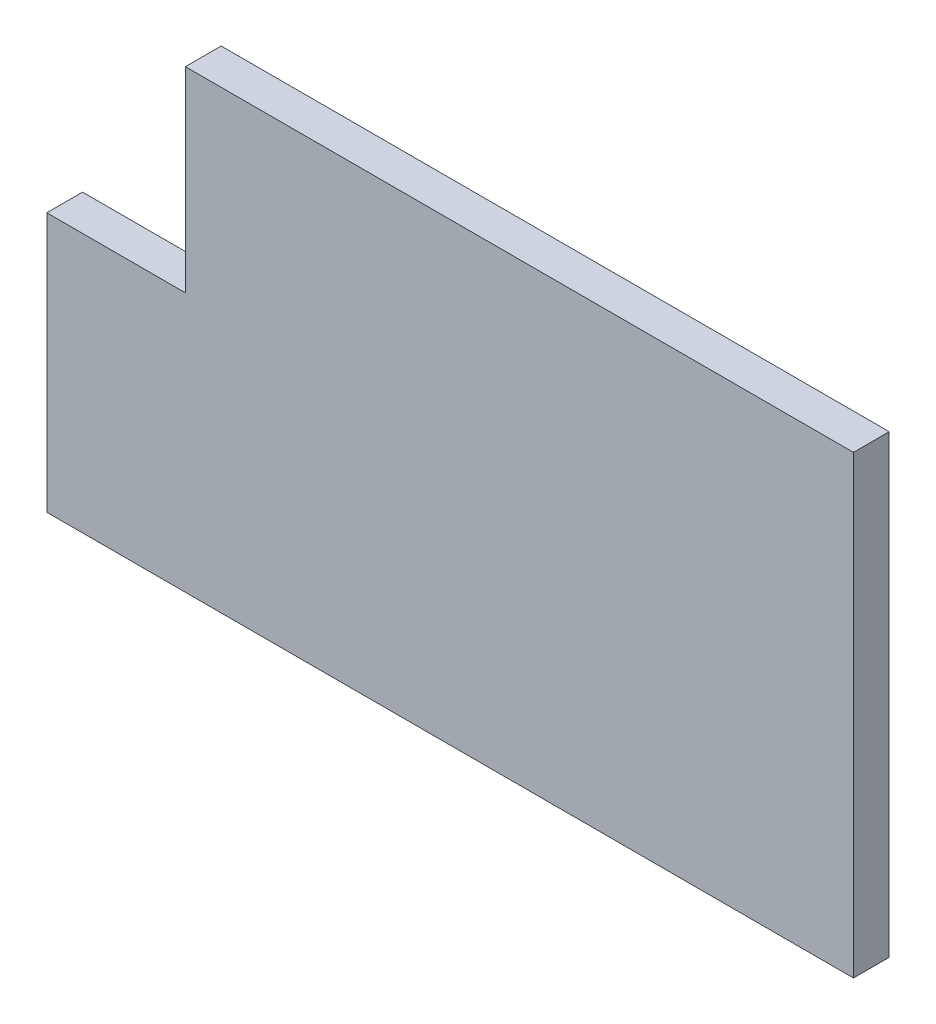
ISO-10303-21;
HEADER;
FILE_DESCRIPTION(('STEP AP214'),'2;1');
FILE_NAME('part.step','',(''),(''),'','','');
FILE_SCHEMA(('AUTOMOTIVE_DESIGN { 1 0 10303 214 1 1 1 1 }'));
ENDSEC;
DATA;
#1=APPLICATION_CONTEXT('core data for automotive mechanical design processes');
#2=APPLICATION_PROTOCOL_DEFINITION('international standard','automotive_design',2000,#1);
#3=PRODUCT_CONTEXT('',#1,'mechanical');
#4=PRODUCT('Part','Part','',(#3));
#5=PRODUCT_RELATED_PRODUCT_CATEGORY('part','',(#4));
#6=PRODUCT_DEFINITION_FORMATION('','',#4);
#7=PRODUCT_DEFINITION_CONTEXT('part definition',#1,'design');
#8=PRODUCT_DEFINITION('design','',#6,#7);
#9=PRODUCT_DEFINITION_SHAPE('','',#8);
#10=(LENGTH_UNIT() NAMED_UNIT(*) SI_UNIT(.MILLI.,.METRE.));
#11=(NAMED_UNIT(*) PLANE_ANGLE_UNIT() SI_UNIT($,.RADIAN.));
#12=(NAMED_UNIT(*) SI_UNIT($,.STERADIAN.) SOLID_ANGLE_UNIT());
#13=UNCERTAINTY_MEASURE_WITH_UNIT(LENGTH_MEASURE(1.E-05),#10,'distance_accuracy_value','');
#14=(GEOMETRIC_REPRESENTATION_CONTEXT(3) GLOBAL_UNCERTAINTY_ASSIGNED_CONTEXT((#13)) GLOBAL_UNIT_ASSIGNED_CONTEXT((#10,
#11,#12)) REPRESENTATION_CONTEXT('',''));
#15=CARTESIAN_POINT('',(0.,0.,0.));
#16=DIRECTION('',(0.,0.,1.));
#17=DIRECTION('',(1.,0.,0.));
#18=AXIS2_PLACEMENT_3D('',#15,#16,#17);
#19=CARTESIAN_POINT('',(606.354027490195,2129.28599467213,400.));
#20=DIRECTION('',(1.,0.,0.));
#21=DIRECTION('',(0.,0.,-1.));
#22=AXIS2_PLACEMENT_3D('',#19,#20,#21);
#23=PLANE('',#22);
#24=DIRECTION('',(0.,-1.,0.));
#25=VECTOR('',#24,1.);
#26=CARTESIAN_POINT('',(606.354027490195,2129.28599467213,0.));
#27=LINE('',#26,#25);
#28=CARTESIAN_POINT('',(606.354027490195,2129.28599467213,0.));
#29=VERTEX_POINT('',#28);
#30=CARTESIAN_POINT('',(606.354027490195,-60.7140053278613,0.));
#31=VERTEX_POINT('',#30);
#32=EDGE_CURVE('E117',#29,#31,#27,.T.);
#33=ORIENTED_EDGE('',*,*,#32,.T.);
#34=DIRECTION('',(0.,0.,-1.));
#35=VECTOR('',#34,1.);
#36=CARTESIAN_POINT('',(606.354027490195,-60.7140053278613,400.));
#37=LINE('',#36,#35);
#38=CARTESIAN_POINT('',(606.354027490195,-60.7140053278613,400.));
#39=VERTEX_POINT('',#38);
#40=EDGE_CURVE('E40',#39,#31,#37,.T.);
#41=ORIENTED_EDGE('',*,*,#40,.F.);
#42=DIRECTION('',(0.,-1.,0.));
#43=VECTOR('',#42,1.);
#44=CARTESIAN_POINT('',(606.354027490195,2129.28599467213,400.));
#45=LINE('',#44,#43);
#46=CARTESIAN_POINT('',(606.354027490195,2129.28599467213,400.));
#47=VERTEX_POINT('',#46);
#48=EDGE_CURVE('E82',#47,#39,#45,.T.);
#49=ORIENTED_EDGE('',*,*,#48,.F.);
#50=DIRECTION('',(0.,0.,-1.));
#51=VECTOR('',#50,1.);
#52=CARTESIAN_POINT('',(606.354027490195,2129.28599467213,400.));
#53=LINE('',#52,#51);
#54=EDGE_CURVE('E11',#47,#29,#53,.T.);
#55=ORIENTED_EDGE('',*,*,#54,.T.);
#56=EDGE_LOOP('',(#33,#41,#49,#55));
#57=FACE_BOUND('',#56,.T.);
#58=ADVANCED_FACE('F32',(#57),#23,.F.);
#59=CARTESIAN_POINT('',(-943.645972509804,-60.7140053278613,400.));
#60=DIRECTION('',(0.,1.,0.));
#61=DIRECTION('',(0.,0.,1.));
#62=AXIS2_PLACEMENT_3D('',#59,#60,#61);
#63=PLANE('',#62);
#64=DIRECTION('',(1.,0.,0.));
#65=VECTOR('',#64,1.);
#66=CARTESIAN_POINT('',(-943.645972509804,-60.7140053278613,0.));
#67=LINE('',#66,#65);
#68=CARTESIAN_POINT('',(-943.645972509804,-60.7140053278613,0.));
#69=VERTEX_POINT('',#68);
#70=EDGE_CURVE('E120',#69,#31,#67,.T.);
#71=ORIENTED_EDGE('',*,*,#70,.F.);
#72=DIRECTION('',(0.,0.,-1.));
#73=VECTOR('',#72,1.);
#74=CARTESIAN_POINT('',(-943.645972509804,-60.7140053278613,400.));
#75=LINE('',#74,#73);
#76=CARTESIAN_POINT('',(-943.645972509804,-60.7140053278613,400.));
#77=VERTEX_POINT('',#76);
#78=EDGE_CURVE('E108',#77,#69,#75,.T.);
#79=ORIENTED_EDGE('',*,*,#78,.F.);
#80=DIRECTION('',(1.,0.,0.));
#81=VECTOR('',#80,1.);
#82=CARTESIAN_POINT('',(-943.645972509804,-60.7140053278613,400.));
#83=LINE('',#82,#81);
#84=EDGE_CURVE('E97',#77,#39,#83,.T.);
#85=ORIENTED_EDGE('',*,*,#84,.T.);
#86=ORIENTED_EDGE('',*,*,#40,.T.);
#87=EDGE_LOOP('',(#71,#79,#85,#86));
#88=FACE_BOUND('',#87,.T.);
#89=ADVANCED_FACE('F133',(#88),#63,.T.);
#90=CARTESIAN_POINT('',(-943.645972509804,-2960.71400532786,400.));
#91=DIRECTION('',(-1.,0.,0.));
#92=DIRECTION('',(0.,0.,1.));
#93=AXIS2_PLACEMENT_3D('',#90,#91,#92);
#94=PLANE('',#93);
#95=DIRECTION('',(0.,1.,0.));
#96=VECTOR('',#95,1.);
#97=CARTESIAN_POINT('',(-943.645972509804,-2960.71400532786,0.));
#98=LINE('',#97,#96);
#99=CARTESIAN_POINT('',(-943.645972509804,-2960.71400532786,0.));
#100=VERTEX_POINT('',#99);
#101=EDGE_CURVE('E105',#100,#69,#98,.T.);
#102=ORIENTED_EDGE('',*,*,#101,.F.);
#103=DIRECTION('',(0.,0.,-1.));
#104=VECTOR('',#103,1.);
#105=CARTESIAN_POINT('',(-943.645972509804,-2960.71400532786,400.));
#106=LINE('',#105,#104);
#107=CARTESIAN_POINT('',(-943.645972509804,-2960.71400532786,400.));
#108=VERTEX_POINT('',#107);
#109=EDGE_CURVE('E103',#108,#100,#106,.T.);
#110=ORIENTED_EDGE('',*,*,#109,.F.);
#111=DIRECTION('',(0.,1.,0.));
#112=VECTOR('',#111,1.);
#113=CARTESIAN_POINT('',(-943.645972509804,-360.714005327861,400.));
#114=LINE('',#113,#112);
#115=EDGE_CURVE('E90',#108,#77,#114,.T.);
#116=ORIENTED_EDGE('',*,*,#115,.T.);
#117=ORIENTED_EDGE('',*,*,#78,.T.);
#118=EDGE_LOOP('',(#102,#110,#116,#117));
#119=FACE_BOUND('',#118,.T.);
#120=ADVANCED_FACE('F104',(#119),#94,.T.);
#121=CARTESIAN_POINT('',(8076.3540274902,-2960.71400532786,400.));
#122=DIRECTION('',(0.,-1.,0.));
#123=DIRECTION('',(1.,0.,0.));
#124=AXIS2_PLACEMENT_3D('',#121,#122,#123);
#125=PLANE('',#124);
#126=DIRECTION('',(-1.,0.,0.));
#127=VECTOR('',#126,1.);
#128=CARTESIAN_POINT('',(8076.3540274902,-2960.71400532786,0.));
#129=LINE('',#128,#127);
#130=CARTESIAN_POINT('',(8076.3540274902,-2960.71400532786,0.));
#131=VERTEX_POINT('',#130);
#132=EDGE_CURVE('E124',#131,#100,#129,.T.);
#133=ORIENTED_EDGE('',*,*,#132,.F.);
#134=DIRECTION('',(0.,0.,-1.));
#135=VECTOR('',#134,1.);
#136=CARTESIAN_POINT('',(8076.3540274902,-2960.71400532786,400.));
#137=LINE('',#136,#135);
#138=CARTESIAN_POINT('',(8076.3540274902,-2960.71400532786,400.));
#139=VERTEX_POINT('',#138);
#140=EDGE_CURVE('E109',#139,#131,#137,.T.);
#141=ORIENTED_EDGE('',*,*,#140,.F.);
#142=DIRECTION('',(-1.,0.,0.));
#143=VECTOR('',#142,1.);
#144=CARTESIAN_POINT('',(-643.645972509803,-2960.71400532786,400.));
#145=LINE('',#144,#143);
#146=EDGE_CURVE('E94',#139,#108,#145,.T.);
#147=ORIENTED_EDGE('',*,*,#146,.T.);
#148=ORIENTED_EDGE('',*,*,#109,.T.);
#149=EDGE_LOOP('',(#133,#141,#147,#148));
#150=FACE_BOUND('',#149,.T.);
#151=ADVANCED_FACE('F111',(#150),#125,.T.);
#152=CARTESIAN_POINT('',(8076.3540274902,2129.28599467213,400.));
#153=DIRECTION('',(1.,0.,0.));
#154=DIRECTION('',(0.,0.,-1.));
#155=AXIS2_PLACEMENT_3D('',#152,#153,#154);
#156=PLANE('',#155);
#157=DIRECTION('',(0.,-1.,0.));
#158=VECTOR('',#157,1.);
#159=CARTESIAN_POINT('',(8076.3540274902,2129.28599467213,0.));
#160=LINE('',#159,#158);
#161=CARTESIAN_POINT('',(8076.3540274902,2129.28599467213,0.));
#162=VERTEX_POINT('',#161);
#163=EDGE_CURVE('E70',#162,#131,#160,.T.);
#164=ORIENTED_EDGE('',*,*,#163,.F.);
#165=DIRECTION('',(0.,0.,-1.));
#166=VECTOR('',#165,1.);
#167=CARTESIAN_POINT('',(8076.3540274902,2129.28599467213,400.));
#168=LINE('',#167,#166);
#169=CARTESIAN_POINT('',(8076.3540274902,2129.28599467213,400.));
#170=VERTEX_POINT('',#169);
#171=EDGE_CURVE('E113',#170,#162,#168,.T.);
#172=ORIENTED_EDGE('',*,*,#171,.F.);
#173=DIRECTION('',(0.,-1.,0.));
#174=VECTOR('',#173,1.);
#175=CARTESIAN_POINT('',(8076.3540274902,-2660.71400532786,400.));
#176=LINE('',#175,#174);
#177=EDGE_CURVE('E48',#170,#139,#176,.T.);
#178=ORIENTED_EDGE('',*,*,#177,.T.);
#179=ORIENTED_EDGE('',*,*,#140,.T.);
#180=EDGE_LOOP('',(#164,#172,#178,#179));
#181=FACE_BOUND('',#180,.T.);
#182=ADVANCED_FACE('F155',(#181),#156,.T.);
#183=CARTESIAN_POINT('',(906.354027490195,2129.28599467213,400.));
#184=DIRECTION('',(0.,1.,0.));
#185=DIRECTION('',(0.,0.,1.));
#186=AXIS2_PLACEMENT_3D('',#183,#184,#185);
#187=PLANE('',#186);
#188=DIRECTION('',(1.,0.,0.));
#189=VECTOR('',#188,1.);
#190=CARTESIAN_POINT('',(906.354027490195,2129.28599467213,0.));
#191=LINE('',#190,#189);
#192=EDGE_CURVE('E74',#29,#162,#191,.T.);
#193=ORIENTED_EDGE('',*,*,#192,.F.);
#194=ORIENTED_EDGE('',*,*,#54,.F.);
#195=DIRECTION('',(-1.,0.,0.));
#196=VECTOR('',#195,1.);
#197=CARTESIAN_POINT('',(906.354027490195,2129.28599467213,400.));
#198=LINE('',#197,#196);
#199=EDGE_CURVE('E128',#170,#47,#198,.T.);
#200=ORIENTED_EDGE('',*,*,#199,.F.);
#201=ORIENTED_EDGE('',*,*,#171,.T.);
#202=EDGE_LOOP('',(#193,#194,#200,#201));
#203=FACE_BOUND('',#202,.T.);
#204=ADVANCED_FACE('F141',(#203),#187,.T.);
#205=CARTESIAN_POINT('',(0.,0.,400.));
#206=DIRECTION('',(0.,0.,1.));
#207=DIRECTION('',(1.,0.,0.));
#208=AXIS2_PLACEMENT_3D('',#205,#206,#207);
#209=PLANE('',#208);
#210=ORIENTED_EDGE('',*,*,#199,.T.);
#211=ORIENTED_EDGE('',*,*,#48,.T.);
#212=ORIENTED_EDGE('',*,*,#84,.F.);
#213=ORIENTED_EDGE('',*,*,#115,.F.);
#214=ORIENTED_EDGE('',*,*,#146,.F.);
#215=ORIENTED_EDGE('',*,*,#177,.F.);
#216=EDGE_LOOP('',(#210,#211,#212,#213,#214,#215));
#217=FACE_BOUND('',#216,.T.);
#218=ADVANCED_FACE('F92',(#217),#209,.T.);
#219=CARTESIAN_POINT('',(0.,0.,0.));
#220=DIRECTION('',(0.,0.,1.));
#221=DIRECTION('',(1.,0.,0.));
#222=AXIS2_PLACEMENT_3D('',#219,#220,#221);
#223=PLANE('',#222);
#224=ORIENTED_EDGE('',*,*,#32,.F.);
#225=ORIENTED_EDGE('',*,*,#192,.T.);
#226=ORIENTED_EDGE('',*,*,#163,.T.);
#227=ORIENTED_EDGE('',*,*,#132,.T.);
#228=ORIENTED_EDGE('',*,*,#101,.T.);
#229=ORIENTED_EDGE('',*,*,#70,.T.);
#230=EDGE_LOOP('',(#224,#225,#226,#227,#228,#229));
#231=FACE_BOUND('',#230,.T.);
#232=ADVANCED_FACE('F135',(#231),#223,.F.);
#233=CLOSED_SHELL('',(#58,#89,#120,#151,#182,#204,#218,#232));
#234=MANIFOLD_SOLID_BREP('B2',#233);
#235=ADVANCED_BREP_SHAPE_REPRESENTATION('',(#18,#234),#14);
#236=SHAPE_DEFINITION_REPRESENTATION(#9,#235);
ENDSEC;
END-ISO-10303-21;
